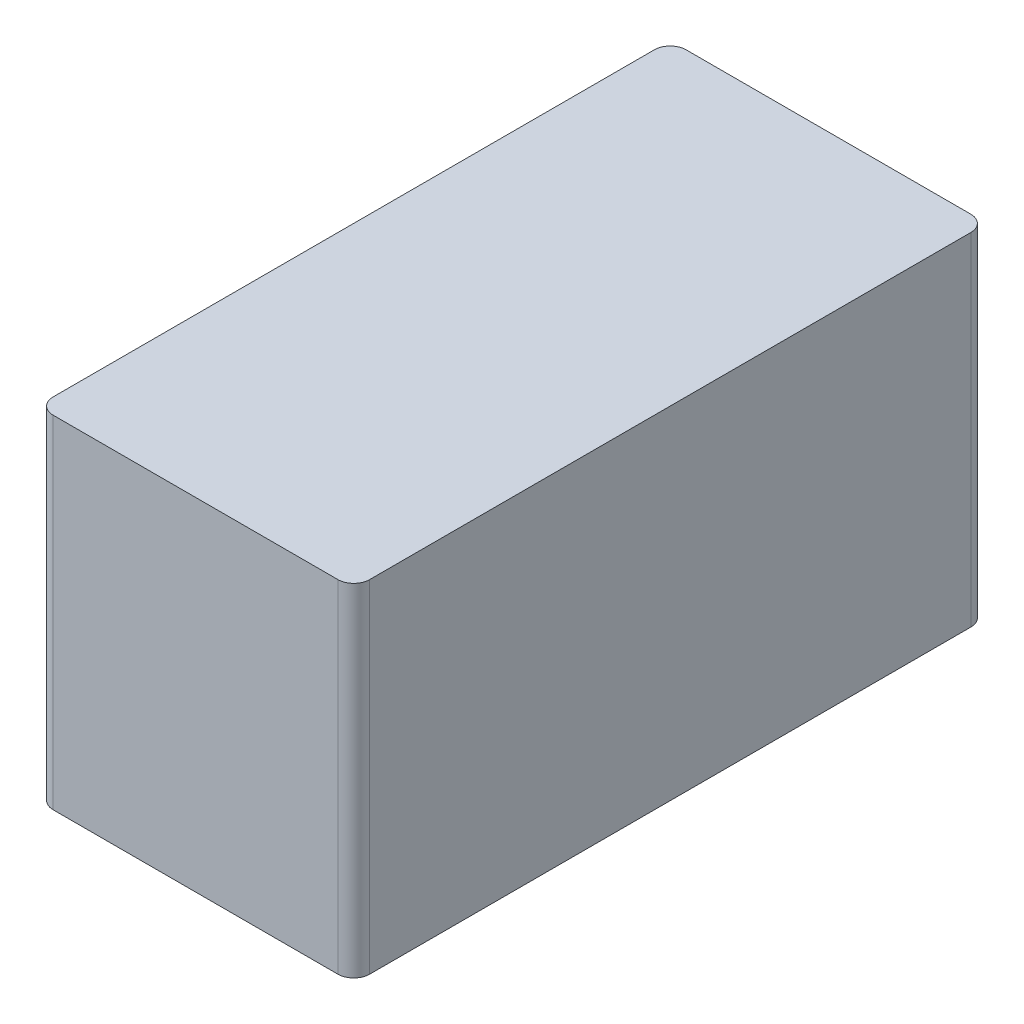
ISO-10303-21;
HEADER;
FILE_DESCRIPTION(('STEP AP214'),'2;1');
FILE_NAME('part.step','',(''),(''),'','','');
FILE_SCHEMA(('AUTOMOTIVE_DESIGN { 1 0 10303 214 1 1 1 1 }'));
ENDSEC;
DATA;
#1=APPLICATION_CONTEXT('core data for automotive mechanical design processes');
#2=APPLICATION_PROTOCOL_DEFINITION('international standard','automotive_design',2000,#1);
#3=PRODUCT_CONTEXT('',#1,'mechanical');
#4=PRODUCT('Part','Part','',(#3));
#5=PRODUCT_RELATED_PRODUCT_CATEGORY('part','',(#4));
#6=PRODUCT_DEFINITION_FORMATION('','',#4);
#7=PRODUCT_DEFINITION_CONTEXT('part definition',#1,'design');
#8=PRODUCT_DEFINITION('design','',#6,#7);
#9=PRODUCT_DEFINITION_SHAPE('','',#8);
#10=(LENGTH_UNIT() NAMED_UNIT(*) SI_UNIT(.MILLI.,.METRE.));
#11=(NAMED_UNIT(*) PLANE_ANGLE_UNIT() SI_UNIT($,.RADIAN.));
#12=(NAMED_UNIT(*) SI_UNIT($,.STERADIAN.) SOLID_ANGLE_UNIT());
#13=UNCERTAINTY_MEASURE_WITH_UNIT(LENGTH_MEASURE(1.E-05),#10,'distance_accuracy_value','');
#14=(GEOMETRIC_REPRESENTATION_CONTEXT(3) GLOBAL_UNCERTAINTY_ASSIGNED_CONTEXT((#13)) GLOBAL_UNIT_ASSIGNED_CONTEXT((#10,
#11,#12)) REPRESENTATION_CONTEXT('',''));
#15=CARTESIAN_POINT('',(0.,0.,0.));
#16=DIRECTION('',(0.,0.,1.));
#17=DIRECTION('',(1.,0.,0.));
#18=AXIS2_PLACEMENT_3D('',#15,#16,#17);
#19=CARTESIAN_POINT('',(10.,10.8,-20.));
#20=DIRECTION('',(-1.,0.,0.));
#21=DIRECTION('',(0.,0.,1.));
#22=AXIS2_PLACEMENT_3D('',#19,#20,#21);
#23=PLANE('',#22);
#24=DIRECTION('',(0.,0.,-1.));
#25=VECTOR('',#24,1.);
#26=CARTESIAN_POINT('',(10.,-10.8,-20.));
#27=LINE('',#26,#25);
#28=CARTESIAN_POINT('',(10.,-10.8,19.));
#29=VERTEX_POINT('',#28);
#30=CARTESIAN_POINT('',(10.,-10.8,-19.));
#31=VERTEX_POINT('',#30);
#32=EDGE_CURVE('E128',#29,#31,#27,.T.);
#33=ORIENTED_EDGE('',*,*,#32,.T.);
#34=DIRECTION('',(0.,-1.,0.));
#35=VECTOR('',#34,1.);
#36=CARTESIAN_POINT('',(10.,10.8,-19.));
#37=LINE('',#36,#35);
#38=CARTESIAN_POINT('',(10.,10.8,-19.));
#39=VERTEX_POINT('',#38);
#40=EDGE_CURVE('E151',#31,#39,#37,.F.);
#41=ORIENTED_EDGE('',*,*,#40,.T.);
#42=DIRECTION('',(0.,0.,-1.));
#43=VECTOR('',#42,1.);
#44=CARTESIAN_POINT('',(10.,10.8,-20.));
#45=LINE('',#44,#43);
#46=CARTESIAN_POINT('',(10.,10.8,19.));
#47=VERTEX_POINT('',#46);
#48=EDGE_CURVE('E126',#47,#39,#45,.T.);
#49=ORIENTED_EDGE('',*,*,#48,.F.);
#50=DIRECTION('',(0.,-1.,0.));
#51=VECTOR('',#50,1.);
#52=CARTESIAN_POINT('',(10.,10.8,19.));
#53=LINE('',#52,#51);
#54=EDGE_CURVE('E148',#47,#29,#53,.T.);
#55=ORIENTED_EDGE('',*,*,#54,.T.);
#56=EDGE_LOOP('',(#33,#41,#49,#55));
#57=FACE_BOUND('',#56,.T.);
#58=ADVANCED_FACE('F33',(#57),#23,.F.);
#59=CARTESIAN_POINT('',(-10.,10.8,-20.));
#60=DIRECTION('',(0.,0.,1.));
#61=DIRECTION('',(1.,0.,0.));
#62=AXIS2_PLACEMENT_3D('',#59,#60,#61);
#63=PLANE('',#62);
#64=DIRECTION('',(-1.,0.,0.));
#65=VECTOR('',#64,1.);
#66=CARTESIAN_POINT('',(-10.,-10.8,-20.));
#67=LINE('',#66,#65);
#68=CARTESIAN_POINT('',(9.,-10.8,-20.));
#69=VERTEX_POINT('',#68);
#70=CARTESIAN_POINT('',(-9.,-10.8,-20.));
#71=VERTEX_POINT('',#70);
#72=EDGE_CURVE('E124',#69,#71,#67,.T.);
#73=ORIENTED_EDGE('',*,*,#72,.T.);
#74=DIRECTION('',(0.,-1.,0.));
#75=VECTOR('',#74,1.);
#76=CARTESIAN_POINT('',(-9.,10.8,-20.));
#77=LINE('',#76,#75);
#78=CARTESIAN_POINT('',(-9.,10.8,-20.));
#79=VERTEX_POINT('',#78);
#80=EDGE_CURVE('E103',#71,#79,#77,.F.);
#81=ORIENTED_EDGE('',*,*,#80,.T.);
#82=DIRECTION('',(-1.,0.,0.));
#83=VECTOR('',#82,1.);
#84=CARTESIAN_POINT('',(-10.,10.8,-20.));
#85=LINE('',#84,#83);
#86=CARTESIAN_POINT('',(9.,10.8,-20.));
#87=VERTEX_POINT('',#86);
#88=EDGE_CURVE('E167',#87,#79,#85,.T.);
#89=ORIENTED_EDGE('',*,*,#88,.F.);
#90=DIRECTION('',(0.,-1.,0.));
#91=VECTOR('',#90,1.);
#92=CARTESIAN_POINT('',(9.,10.8,-20.));
#93=LINE('',#92,#91);
#94=EDGE_CURVE('E108',#87,#69,#93,.T.);
#95=ORIENTED_EDGE('',*,*,#94,.T.);
#96=EDGE_LOOP('',(#73,#81,#89,#95));
#97=FACE_BOUND('',#96,.T.);
#98=ADVANCED_FACE('F184',(#97),#63,.F.);
#99=CARTESIAN_POINT('',(-10.,10.8,-20.));
#100=DIRECTION('',(1.,0.,0.));
#101=DIRECTION('',(0.,0.,-1.));
#102=AXIS2_PLACEMENT_3D('',#99,#100,#101);
#103=PLANE('',#102);
#104=DIRECTION('',(0.,0.,1.));
#105=VECTOR('',#104,1.);
#106=CARTESIAN_POINT('',(-10.,10.8,-20.));
#107=LINE('',#106,#105);
#108=CARTESIAN_POINT('',(-10.,10.8,-19.));
#109=VERTEX_POINT('',#108);
#110=CARTESIAN_POINT('',(-10.,10.8,19.));
#111=VERTEX_POINT('',#110);
#112=EDGE_CURVE('E117',#109,#111,#107,.T.);
#113=ORIENTED_EDGE('',*,*,#112,.F.);
#114=DIRECTION('',(0.,-1.,0.));
#115=VECTOR('',#114,1.);
#116=CARTESIAN_POINT('',(-10.,10.8,-19.));
#117=LINE('',#116,#115);
#118=CARTESIAN_POINT('',(-10.,-10.8,-19.));
#119=VERTEX_POINT('',#118);
#120=EDGE_CURVE('E102',#109,#119,#117,.T.);
#121=ORIENTED_EDGE('',*,*,#120,.T.);
#122=DIRECTION('',(0.,0.,1.));
#123=VECTOR('',#122,1.);
#124=CARTESIAN_POINT('',(-10.,-10.8,-20.));
#125=LINE('',#124,#123);
#126=CARTESIAN_POINT('',(-10.,-10.8,19.));
#127=VERTEX_POINT('',#126);
#128=EDGE_CURVE('E115',#119,#127,#125,.T.);
#129=ORIENTED_EDGE('',*,*,#128,.T.);
#130=DIRECTION('',(0.,-1.,0.));
#131=VECTOR('',#130,1.);
#132=CARTESIAN_POINT('',(-10.,10.8,19.));
#133=LINE('',#132,#131);
#134=EDGE_CURVE('E119',#127,#111,#133,.F.);
#135=ORIENTED_EDGE('',*,*,#134,.T.);
#136=EDGE_LOOP('',(#113,#121,#129,#135));
#137=FACE_BOUND('',#136,.T.);
#138=ADVANCED_FACE('F114',(#137),#103,.F.);
#139=CARTESIAN_POINT('',(-10.,10.8,20.));
#140=DIRECTION('',(0.,0.,-1.));
#141=DIRECTION('',(-1.,0.,0.));
#142=AXIS2_PLACEMENT_3D('',#139,#140,#141);
#143=PLANE('',#142);
#144=DIRECTION('',(1.,0.,0.));
#145=VECTOR('',#144,1.);
#146=CARTESIAN_POINT('',(-10.,-10.8,20.));
#147=LINE('',#146,#145);
#148=CARTESIAN_POINT('',(-9.,-10.8,20.));
#149=VERTEX_POINT('',#148);
#150=CARTESIAN_POINT('',(9.,-10.8,20.));
#151=VERTEX_POINT('',#150);
#152=EDGE_CURVE('E123',#149,#151,#147,.T.);
#153=ORIENTED_EDGE('',*,*,#152,.T.);
#154=DIRECTION('',(0.,-1.,0.));
#155=VECTOR('',#154,1.);
#156=CARTESIAN_POINT('',(9.,10.8,20.));
#157=LINE('',#156,#155);
#158=CARTESIAN_POINT('',(9.,10.8,20.));
#159=VERTEX_POINT('',#158);
#160=EDGE_CURVE('E11',#151,#159,#157,.F.);
#161=ORIENTED_EDGE('',*,*,#160,.T.);
#162=DIRECTION('',(1.,0.,0.));
#163=VECTOR('',#162,1.);
#164=CARTESIAN_POINT('',(-10.,10.8,20.));
#165=LINE('',#164,#163);
#166=CARTESIAN_POINT('',(-9.,10.8,20.));
#167=VERTEX_POINT('',#166);
#168=EDGE_CURVE('E132',#167,#159,#165,.T.);
#169=ORIENTED_EDGE('',*,*,#168,.F.);
#170=DIRECTION('',(0.,-1.,0.));
#171=VECTOR('',#170,1.);
#172=CARTESIAN_POINT('',(-9.,10.8,20.));
#173=LINE('',#172,#171);
#174=EDGE_CURVE('E41',#167,#149,#173,.T.);
#175=ORIENTED_EDGE('',*,*,#174,.T.);
#176=EDGE_LOOP('',(#153,#161,#169,#175));
#177=FACE_BOUND('',#176,.T.);
#178=ADVANCED_FACE('F154',(#177),#143,.F.);
#179=CARTESIAN_POINT('',(0.,10.8,0.));
#180=DIRECTION('',(0.,1.,0.));
#181=DIRECTION('',(0.,0.,1.));
#182=AXIS2_PLACEMENT_3D('',#179,#180,#181);
#183=PLANE('',#182);
#184=ORIENTED_EDGE('',*,*,#88,.T.);
#185=CARTESIAN_POINT('',(-9.,10.8,-19.));
#186=DIRECTION('',(0.,1.,0.));
#187=DIRECTION('',(0.,0.,1.));
#188=AXIS2_PLACEMENT_3D('',#185,#186,#187);
#189=CIRCLE('',#188,1.);
#190=EDGE_CURVE('E146',#79,#109,#189,.T.);
#191=ORIENTED_EDGE('',*,*,#190,.T.);
#192=ORIENTED_EDGE('',*,*,#112,.T.);
#193=CARTESIAN_POINT('',(-9.,10.8,19.));
#194=DIRECTION('',(0.,1.,0.));
#195=DIRECTION('',(0.,0.,1.));
#196=AXIS2_PLACEMENT_3D('',#193,#194,#195);
#197=CIRCLE('',#196,1.);
#198=EDGE_CURVE('E53',#111,#167,#197,.T.);
#199=ORIENTED_EDGE('',*,*,#198,.T.);
#200=ORIENTED_EDGE('',*,*,#168,.T.);
#201=CARTESIAN_POINT('',(9.,10.8,19.));
#202=DIRECTION('',(0.,1.,0.));
#203=DIRECTION('',(0.,0.,1.));
#204=AXIS2_PLACEMENT_3D('',#201,#202,#203);
#205=CIRCLE('',#204,1.);
#206=EDGE_CURVE('E142',#159,#47,#205,.T.);
#207=ORIENTED_EDGE('',*,*,#206,.T.);
#208=ORIENTED_EDGE('',*,*,#48,.T.);
#209=CARTESIAN_POINT('',(9.,10.8,-19.));
#210=DIRECTION('',(0.,1.,0.));
#211=DIRECTION('',(0.,0.,1.));
#212=AXIS2_PLACEMENT_3D('',#209,#210,#211);
#213=CIRCLE('',#212,1.);
#214=EDGE_CURVE('E144',#39,#87,#213,.T.);
#215=ORIENTED_EDGE('',*,*,#214,.T.);
#216=EDGE_LOOP('',(#184,#191,#192,#199,#200,#207,#208,#215));
#217=FACE_BOUND('',#216,.T.);
#218=ADVANCED_FACE('F173',(#217),#183,.T.);
#219=CARTESIAN_POINT('',(0.,-10.8,0.));
#220=DIRECTION('',(0.,1.,0.));
#221=DIRECTION('',(0.,0.,1.));
#222=AXIS2_PLACEMENT_3D('',#219,#220,#221);
#223=PLANE('',#222);
#224=ORIENTED_EDGE('',*,*,#128,.F.);
#225=CARTESIAN_POINT('',(-9.,-10.8,-19.));
#226=DIRECTION('',(0.,1.,0.));
#227=DIRECTION('',(0.,0.,1.));
#228=AXIS2_PLACEMENT_3D('',#225,#226,#227);
#229=CIRCLE('',#228,1.);
#230=EDGE_CURVE('E98',#119,#71,#229,.F.);
#231=ORIENTED_EDGE('',*,*,#230,.T.);
#232=ORIENTED_EDGE('',*,*,#72,.F.);
#233=CARTESIAN_POINT('',(9.,-10.8,-19.));
#234=DIRECTION('',(0.,1.,0.));
#235=DIRECTION('',(0.,0.,1.));
#236=AXIS2_PLACEMENT_3D('',#233,#234,#235);
#237=CIRCLE('',#236,1.);
#238=EDGE_CURVE('E109',#69,#31,#237,.F.);
#239=ORIENTED_EDGE('',*,*,#238,.T.);
#240=ORIENTED_EDGE('',*,*,#32,.F.);
#241=CARTESIAN_POINT('',(9.,-10.8,19.));
#242=DIRECTION('',(0.,1.,0.));
#243=DIRECTION('',(0.,0.,1.));
#244=AXIS2_PLACEMENT_3D('',#241,#242,#243);
#245=CIRCLE('',#244,1.);
#246=EDGE_CURVE('E135',#29,#151,#245,.F.);
#247=ORIENTED_EDGE('',*,*,#246,.T.);
#248=ORIENTED_EDGE('',*,*,#152,.F.);
#249=CARTESIAN_POINT('',(-9.,-10.8,19.));
#250=DIRECTION('',(0.,1.,0.));
#251=DIRECTION('',(0.,0.,1.));
#252=AXIS2_PLACEMENT_3D('',#249,#250,#251);
#253=CIRCLE('',#252,1.);
#254=EDGE_CURVE('E118',#149,#127,#253,.F.);
#255=ORIENTED_EDGE('',*,*,#254,.T.);
#256=EDGE_LOOP('',(#224,#231,#232,#239,#240,#247,#248,#255));
#257=FACE_BOUND('',#256,.T.);
#258=ADVANCED_FACE('F121',(#257),#223,.F.);
#259=CARTESIAN_POINT('',(-9.,10.8,-19.));
#260=DIRECTION('',(0.,-1.,0.));
#261=DIRECTION('',(0.,0.,-1.));
#262=AXIS2_PLACEMENT_3D('',#259,#260,#261);
#263=CYLINDRICAL_SURFACE('',#262,1.);
#264=ORIENTED_EDGE('',*,*,#190,.F.);
#265=ORIENTED_EDGE('',*,*,#80,.F.);
#266=ORIENTED_EDGE('',*,*,#230,.F.);
#267=ORIENTED_EDGE('',*,*,#120,.F.);
#268=EDGE_LOOP('',(#264,#265,#266,#267));
#269=FACE_BOUND('',#268,.T.);
#270=ADVANCED_FACE('F101',(#269),#263,.T.);
#271=CARTESIAN_POINT('',(9.,10.8,-19.));
#272=DIRECTION('',(0.,-1.,0.));
#273=DIRECTION('',(0.,0.,-1.));
#274=AXIS2_PLACEMENT_3D('',#271,#272,#273);
#275=CYLINDRICAL_SURFACE('',#274,1.);
#276=ORIENTED_EDGE('',*,*,#214,.F.);
#277=ORIENTED_EDGE('',*,*,#40,.F.);
#278=ORIENTED_EDGE('',*,*,#238,.F.);
#279=ORIENTED_EDGE('',*,*,#94,.F.);
#280=EDGE_LOOP('',(#276,#277,#278,#279));
#281=FACE_BOUND('',#280,.T.);
#282=ADVANCED_FACE('F195',(#281),#275,.T.);
#283=CARTESIAN_POINT('',(9.,10.8,19.));
#284=DIRECTION('',(0.,-1.,0.));
#285=DIRECTION('',(0.,0.,-1.));
#286=AXIS2_PLACEMENT_3D('',#283,#284,#285);
#287=CYLINDRICAL_SURFACE('',#286,1.);
#288=ORIENTED_EDGE('',*,*,#206,.F.);
#289=ORIENTED_EDGE('',*,*,#160,.F.);
#290=ORIENTED_EDGE('',*,*,#246,.F.);
#291=ORIENTED_EDGE('',*,*,#54,.F.);
#292=EDGE_LOOP('',(#288,#289,#290,#291));
#293=FACE_BOUND('',#292,.T.);
#294=ADVANCED_FACE('F161',(#293),#287,.T.);
#295=CARTESIAN_POINT('',(-9.,10.8,19.));
#296=DIRECTION('',(0.,-1.,0.));
#297=DIRECTION('',(0.,0.,-1.));
#298=AXIS2_PLACEMENT_3D('',#295,#296,#297);
#299=CYLINDRICAL_SURFACE('',#298,1.);
#300=ORIENTED_EDGE('',*,*,#198,.F.);
#301=ORIENTED_EDGE('',*,*,#134,.F.);
#302=ORIENTED_EDGE('',*,*,#254,.F.);
#303=ORIENTED_EDGE('',*,*,#174,.F.);
#304=EDGE_LOOP('',(#300,#301,#302,#303));
#305=FACE_BOUND('',#304,.T.);
#306=ADVANCED_FACE('F35',(#305),#299,.T.);
#307=CLOSED_SHELL('',(#58,#98,#138,#178,#218,#258,#270,#282,#294,#306));
#308=MANIFOLD_SOLID_BREP('B2',#307);
#309=ADVANCED_BREP_SHAPE_REPRESENTATION('',(#18,#308),#14);
#310=SHAPE_DEFINITION_REPRESENTATION(#9,#309);
ENDSEC;
END-ISO-10303-21;
